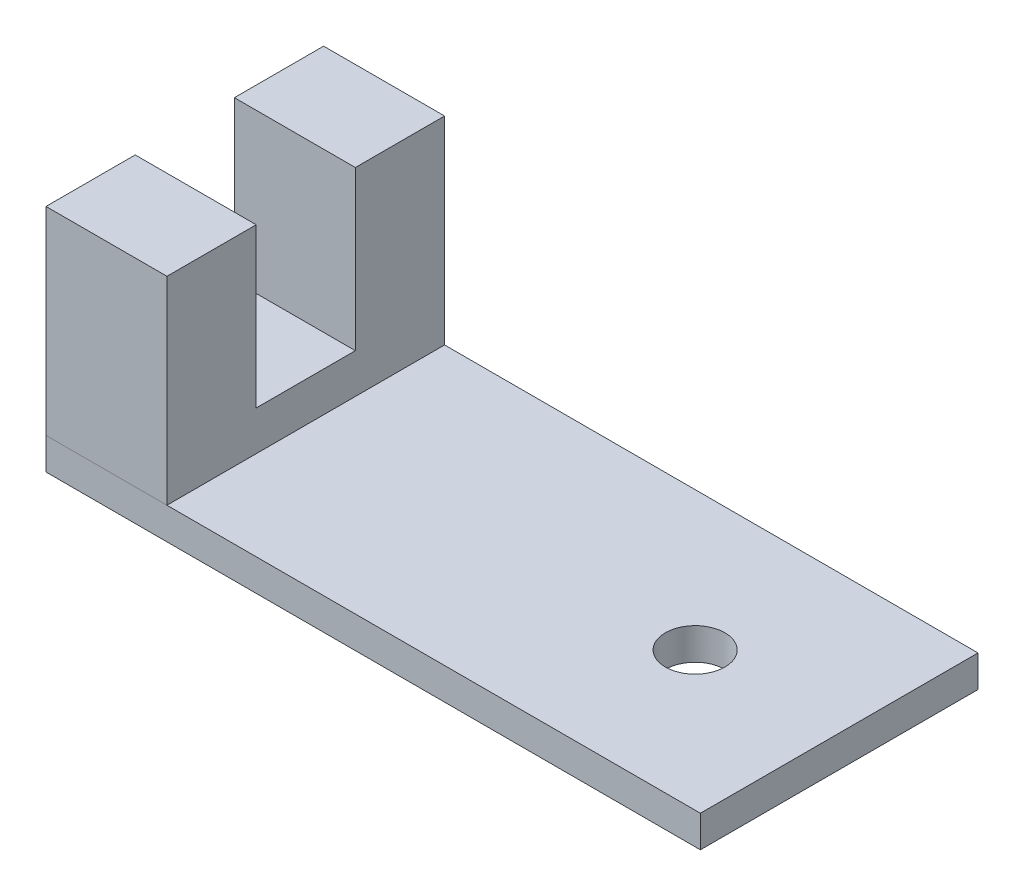
ISO-10303-21;
HEADER;
FILE_DESCRIPTION(('STEP AP214'),'2;1');
FILE_NAME('part.step','',(''),(''),'','','');
FILE_SCHEMA(('AUTOMOTIVE_DESIGN { 1 0 10303 214 1 1 1 1 }'));
ENDSEC;
DATA;
#1=APPLICATION_CONTEXT('core data for automotive mechanical design processes');
#2=APPLICATION_PROTOCOL_DEFINITION('international standard','automotive_design',2000,#1);
#3=PRODUCT_CONTEXT('',#1,'mechanical');
#4=PRODUCT('Part','Part','',(#3));
#5=PRODUCT_RELATED_PRODUCT_CATEGORY('part','',(#4));
#6=PRODUCT_DEFINITION_FORMATION('','',#4);
#7=PRODUCT_DEFINITION_CONTEXT('part definition',#1,'design');
#8=PRODUCT_DEFINITION('design','',#6,#7);
#9=PRODUCT_DEFINITION_SHAPE('','',#8);
#10=(LENGTH_UNIT() NAMED_UNIT(*) SI_UNIT(.MILLI.,.METRE.));
#11=(NAMED_UNIT(*) PLANE_ANGLE_UNIT() SI_UNIT($,.RADIAN.));
#12=(NAMED_UNIT(*) SI_UNIT($,.STERADIAN.) SOLID_ANGLE_UNIT());
#13=UNCERTAINTY_MEASURE_WITH_UNIT(LENGTH_MEASURE(1.E-05),#10,'distance_accuracy_value','');
#14=(GEOMETRIC_REPRESENTATION_CONTEXT(3) GLOBAL_UNCERTAINTY_ASSIGNED_CONTEXT((#13)) GLOBAL_UNIT_ASSIGNED_CONTEXT((#10,
#11,#12)) REPRESENTATION_CONTEXT('',''));
#15=CARTESIAN_POINT('',(0.,0.,0.));
#16=DIRECTION('',(0.,0.,1.));
#17=DIRECTION('',(1.,0.,0.));
#18=AXIS2_PLACEMENT_3D('',#15,#16,#17);
#19=CARTESIAN_POINT('',(-10.4,1.6,7.));
#20=DIRECTION('',(0.,-1.,0.));
#21=DIRECTION('',(0.,0.,-1.));
#22=AXIS2_PLACEMENT_3D('',#19,#20,#21);
#23=PLANE('',#22);
#24=DIRECTION('',(0.,0.,1.));
#25=VECTOR('',#24,1.);
#26=CARTESIAN_POINT('',(-16.5,1.6,7.));
#27=LINE('',#26,#25);
#28=CARTESIAN_POINT('',(-16.5,1.6,-7.));
#29=VERTEX_POINT('',#28);
#30=CARTESIAN_POINT('',(-16.5,1.6,7.));
#31=VERTEX_POINT('',#30);
#32=EDGE_CURVE('E143',#29,#31,#27,.T.);
#33=ORIENTED_EDGE('',*,*,#32,.F.);
#34=DIRECTION('',(-1.,0.,0.));
#35=VECTOR('',#34,1.);
#36=CARTESIAN_POINT('',(-10.4,1.6,-7.));
#37=LINE('',#36,#35);
#38=CARTESIAN_POINT('',(-10.4,1.6,-7.));
#39=VERTEX_POINT('',#38);
#40=EDGE_CURVE('E12',#39,#29,#37,.T.);
#41=ORIENTED_EDGE('',*,*,#40,.F.);
#42=DIRECTION('',(0.,0.,1.));
#43=VECTOR('',#42,1.);
#44=CARTESIAN_POINT('',(-10.4,1.6,7.));
#45=LINE('',#44,#43);
#46=CARTESIAN_POINT('',(-10.4,1.6,7.));
#47=VERTEX_POINT('',#46);
#48=EDGE_CURVE('E163',#39,#47,#45,.T.);
#49=ORIENTED_EDGE('',*,*,#48,.T.);
#50=DIRECTION('',(-1.,0.,0.));
#51=VECTOR('',#50,1.);
#52=CARTESIAN_POINT('',(-10.4,1.6,7.));
#53=LINE('',#52,#51);
#54=EDGE_CURVE('E49',#47,#31,#53,.T.);
#55=ORIENTED_EDGE('',*,*,#54,.T.);
#56=EDGE_LOOP('',(#33,#41,#49,#55));
#57=FACE_BOUND('',#56,.T.);
#58=ADVANCED_FACE('F46',(#57),#23,.T.);
#59=CARTESIAN_POINT('',(-10.4,1.6,-7.));
#60=DIRECTION('',(0.,0.,-1.));
#61=DIRECTION('',(-1.,0.,0.));
#62=AXIS2_PLACEMENT_3D('',#59,#60,#61);
#63=PLANE('',#62);
#64=DIRECTION('',(0.,-1.,0.));
#65=VECTOR('',#64,1.);
#66=CARTESIAN_POINT('',(-16.5,1.6,-7.));
#67=LINE('',#66,#65);
#68=CARTESIAN_POINT('',(-16.5,11.6,-7.));
#69=VERTEX_POINT('',#68);
#70=EDGE_CURVE('E161',#69,#29,#67,.T.);
#71=ORIENTED_EDGE('',*,*,#70,.F.);
#72=DIRECTION('',(-1.,0.,0.));
#73=VECTOR('',#72,1.);
#74=CARTESIAN_POINT('',(-10.4,11.6,-7.));
#75=LINE('',#74,#73);
#76=CARTESIAN_POINT('',(-10.4,11.6,-7.));
#77=VERTEX_POINT('',#76);
#78=EDGE_CURVE('E55',#77,#69,#75,.T.);
#79=ORIENTED_EDGE('',*,*,#78,.F.);
#80=DIRECTION('',(0.,-1.,0.));
#81=VECTOR('',#80,1.);
#82=CARTESIAN_POINT('',(-10.4,1.6,-7.));
#83=LINE('',#82,#81);
#84=EDGE_CURVE('E133',#77,#39,#83,.T.);
#85=ORIENTED_EDGE('',*,*,#84,.T.);
#86=ORIENTED_EDGE('',*,*,#40,.T.);
#87=EDGE_LOOP('',(#71,#79,#85,#86));
#88=FACE_BOUND('',#87,.T.);
#89=ADVANCED_FACE('F175',(#88),#63,.T.);
#90=CARTESIAN_POINT('',(-10.4,11.6,-7.));
#91=DIRECTION('',(0.,1.,0.));
#92=DIRECTION('',(0.,0.,1.));
#93=AXIS2_PLACEMENT_3D('',#90,#91,#92);
#94=PLANE('',#93);
#95=DIRECTION('',(0.,0.,-1.));
#96=VECTOR('',#95,1.);
#97=CARTESIAN_POINT('',(-16.5,11.6,-7.));
#98=LINE('',#97,#96);
#99=CARTESIAN_POINT('',(-16.5,11.6,-2.5));
#100=VERTEX_POINT('',#99);
#101=EDGE_CURVE('E120',#100,#69,#98,.T.);
#102=ORIENTED_EDGE('',*,*,#101,.F.);
#103=DIRECTION('',(-1.,0.,0.));
#104=VECTOR('',#103,1.);
#105=CARTESIAN_POINT('',(-10.4,11.6,-2.5));
#106=LINE('',#105,#104);
#107=CARTESIAN_POINT('',(-10.4,11.6,-2.5));
#108=VERTEX_POINT('',#107);
#109=EDGE_CURVE('E115',#108,#100,#106,.T.);
#110=ORIENTED_EDGE('',*,*,#109,.F.);
#111=DIRECTION('',(0.,0.,-1.));
#112=VECTOR('',#111,1.);
#113=CARTESIAN_POINT('',(-10.4,11.6,-7.));
#114=LINE('',#113,#112);
#115=EDGE_CURVE('E118',#108,#77,#114,.T.);
#116=ORIENTED_EDGE('',*,*,#115,.T.);
#117=ORIENTED_EDGE('',*,*,#78,.T.);
#118=EDGE_LOOP('',(#102,#110,#116,#117));
#119=FACE_BOUND('',#118,.T.);
#120=ADVANCED_FACE('F117',(#119),#94,.T.);
#121=CARTESIAN_POINT('',(-10.4,11.6,-2.5));
#122=DIRECTION('',(0.,0.,1.));
#123=DIRECTION('',(0.,-1.,0.));
#124=AXIS2_PLACEMENT_3D('',#121,#122,#123);
#125=PLANE('',#124);
#126=DIRECTION('',(0.,1.,0.));
#127=VECTOR('',#126,1.);
#128=CARTESIAN_POINT('',(-16.5,11.6,-2.5));
#129=LINE('',#128,#127);
#130=CARTESIAN_POINT('',(-16.5,3.6,-2.5));
#131=VERTEX_POINT('',#130);
#132=EDGE_CURVE('E158',#131,#100,#129,.T.);
#133=ORIENTED_EDGE('',*,*,#132,.F.);
#134=DIRECTION('',(-1.,0.,0.));
#135=VECTOR('',#134,1.);
#136=CARTESIAN_POINT('',(-10.4,3.6,-2.5));
#137=LINE('',#136,#135);
#138=CARTESIAN_POINT('',(-10.4,3.6,-2.5));
#139=VERTEX_POINT('',#138);
#140=EDGE_CURVE('E125',#139,#131,#137,.T.);
#141=ORIENTED_EDGE('',*,*,#140,.F.);
#142=DIRECTION('',(0.,1.,0.));
#143=VECTOR('',#142,1.);
#144=CARTESIAN_POINT('',(-10.4,11.6,-2.5));
#145=LINE('',#144,#143);
#146=EDGE_CURVE('E131',#139,#108,#145,.T.);
#147=ORIENTED_EDGE('',*,*,#146,.T.);
#148=ORIENTED_EDGE('',*,*,#109,.T.);
#149=EDGE_LOOP('',(#133,#141,#147,#148));
#150=FACE_BOUND('',#149,.T.);
#151=ADVANCED_FACE('F135',(#150),#125,.T.);
#152=CARTESIAN_POINT('',(-10.4,3.6,-2.5));
#153=DIRECTION('',(0.,1.,0.));
#154=DIRECTION('',(0.,0.,1.));
#155=AXIS2_PLACEMENT_3D('',#152,#153,#154);
#156=PLANE('',#155);
#157=DIRECTION('',(0.,0.,-1.));
#158=VECTOR('',#157,1.);
#159=CARTESIAN_POINT('',(-16.5,3.6,-2.5));
#160=LINE('',#159,#158);
#161=CARTESIAN_POINT('',(-16.5,3.6,2.5));
#162=VERTEX_POINT('',#161);
#163=EDGE_CURVE('E155',#162,#131,#160,.T.);
#164=ORIENTED_EDGE('',*,*,#163,.F.);
#165=DIRECTION('',(-1.,0.,0.));
#166=VECTOR('',#165,1.);
#167=CARTESIAN_POINT('',(-10.4,3.6,2.5));
#168=LINE('',#167,#166);
#169=CARTESIAN_POINT('',(-10.4,3.6,2.5));
#170=VERTEX_POINT('',#169);
#171=EDGE_CURVE('E167',#170,#162,#168,.T.);
#172=ORIENTED_EDGE('',*,*,#171,.F.);
#173=DIRECTION('',(0.,0.,-1.));
#174=VECTOR('',#173,1.);
#175=CARTESIAN_POINT('',(-10.4,3.6,-2.5));
#176=LINE('',#175,#174);
#177=EDGE_CURVE('E136',#170,#139,#176,.T.);
#178=ORIENTED_EDGE('',*,*,#177,.T.);
#179=ORIENTED_EDGE('',*,*,#140,.T.);
#180=EDGE_LOOP('',(#164,#172,#178,#179));
#181=FACE_BOUND('',#180,.T.);
#182=ADVANCED_FACE('F188',(#181),#156,.T.);
#183=CARTESIAN_POINT('',(-10.4,3.6,2.5));
#184=DIRECTION('',(0.,0.,-1.));
#185=DIRECTION('',(-1.,0.,0.));
#186=AXIS2_PLACEMENT_3D('',#183,#184,#185);
#187=PLANE('',#186);
#188=DIRECTION('',(0.,-1.,0.));
#189=VECTOR('',#188,1.);
#190=CARTESIAN_POINT('',(-16.5,3.6,2.5));
#191=LINE('',#190,#189);
#192=CARTESIAN_POINT('',(-16.5,11.6,2.5));
#193=VERTEX_POINT('',#192);
#194=EDGE_CURVE('E152',#193,#162,#191,.T.);
#195=ORIENTED_EDGE('',*,*,#194,.F.);
#196=DIRECTION('',(-1.,0.,0.));
#197=VECTOR('',#196,1.);
#198=CARTESIAN_POINT('',(-10.4,11.6,2.5));
#199=LINE('',#198,#197);
#200=CARTESIAN_POINT('',(-10.4,11.6,2.5));
#201=VERTEX_POINT('',#200);
#202=EDGE_CURVE('E169',#201,#193,#199,.T.);
#203=ORIENTED_EDGE('',*,*,#202,.F.);
#204=DIRECTION('',(0.,-1.,0.));
#205=VECTOR('',#204,1.);
#206=CARTESIAN_POINT('',(-10.4,3.6,2.5));
#207=LINE('',#206,#205);
#208=EDGE_CURVE('E138',#201,#170,#207,.T.);
#209=ORIENTED_EDGE('',*,*,#208,.T.);
#210=ORIENTED_EDGE('',*,*,#171,.T.);
#211=EDGE_LOOP('',(#195,#203,#209,#210));
#212=FACE_BOUND('',#211,.T.);
#213=ADVANCED_FACE('F191',(#212),#187,.T.);
#214=CARTESIAN_POINT('',(-10.4,11.6,2.5));
#215=DIRECTION('',(0.,1.,0.));
#216=DIRECTION('',(0.,0.,1.));
#217=AXIS2_PLACEMENT_3D('',#214,#215,#216);
#218=PLANE('',#217);
#219=DIRECTION('',(0.,0.,-1.));
#220=VECTOR('',#219,1.);
#221=CARTESIAN_POINT('',(-16.5,11.6,2.5));
#222=LINE('',#221,#220);
#223=CARTESIAN_POINT('',(-16.5,11.6,7.));
#224=VERTEX_POINT('',#223);
#225=EDGE_CURVE('E149',#224,#193,#222,.T.);
#226=ORIENTED_EDGE('',*,*,#225,.F.);
#227=DIRECTION('',(-1.,0.,0.));
#228=VECTOR('',#227,1.);
#229=CARTESIAN_POINT('',(-10.4,11.6,7.));
#230=LINE('',#229,#228);
#231=CARTESIAN_POINT('',(-10.4,11.6,7.));
#232=VERTEX_POINT('',#231);
#233=EDGE_CURVE('E170',#232,#224,#230,.T.);
#234=ORIENTED_EDGE('',*,*,#233,.F.);
#235=DIRECTION('',(0.,0.,-1.));
#236=VECTOR('',#235,1.);
#237=CARTESIAN_POINT('',(-10.4,11.6,2.5));
#238=LINE('',#237,#236);
#239=EDGE_CURVE('E266',#232,#201,#238,.T.);
#240=ORIENTED_EDGE('',*,*,#239,.T.);
#241=ORIENTED_EDGE('',*,*,#202,.T.);
#242=EDGE_LOOP('',(#226,#234,#240,#241));
#243=FACE_BOUND('',#242,.T.);
#244=ADVANCED_FACE('F195',(#243),#218,.T.);
#245=CARTESIAN_POINT('',(-10.4,11.6,7.));
#246=DIRECTION('',(0.,0.,1.));
#247=DIRECTION('',(1.,0.,0.));
#248=AXIS2_PLACEMENT_3D('',#245,#246,#247);
#249=PLANE('',#248);
#250=DIRECTION('',(0.,1.,0.));
#251=VECTOR('',#250,1.);
#252=CARTESIAN_POINT('',(-16.5,11.6,7.));
#253=LINE('',#252,#251);
#254=EDGE_CURVE('E146',#31,#224,#253,.T.);
#255=ORIENTED_EDGE('',*,*,#254,.F.);
#256=ORIENTED_EDGE('',*,*,#54,.F.);
#257=DIRECTION('',(0.,1.,0.));
#258=VECTOR('',#257,1.);
#259=CARTESIAN_POINT('',(-10.4,11.6,7.));
#260=LINE('',#259,#258);
#261=EDGE_CURVE('E267',#47,#232,#260,.T.);
#262=ORIENTED_EDGE('',*,*,#261,.T.);
#263=ORIENTED_EDGE('',*,*,#233,.T.);
#264=EDGE_LOOP('',(#255,#256,#262,#263));
#265=FACE_BOUND('',#264,.T.);
#266=ADVANCED_FACE('F172',(#265),#249,.T.);
#267=CARTESIAN_POINT('',(-10.4,0.,0.));
#268=DIRECTION('',(1.,0.,0.));
#269=DIRECTION('',(0.,0.,-1.));
#270=AXIS2_PLACEMENT_3D('',#267,#268,#269);
#271=PLANE('',#270);
#272=ORIENTED_EDGE('',*,*,#48,.F.);
#273=ORIENTED_EDGE('',*,*,#84,.F.);
#274=ORIENTED_EDGE('',*,*,#115,.F.);
#275=ORIENTED_EDGE('',*,*,#146,.F.);
#276=ORIENTED_EDGE('',*,*,#177,.F.);
#277=ORIENTED_EDGE('',*,*,#208,.F.);
#278=ORIENTED_EDGE('',*,*,#239,.F.);
#279=ORIENTED_EDGE('',*,*,#261,.F.);
#280=EDGE_LOOP('',(#272,#273,#274,#275,#276,#277,#278,#279));
#281=FACE_BOUND('',#280,.T.);
#282=ADVANCED_FACE('F129',(#281),#271,.T.);
#283=CARTESIAN_POINT('',(-16.5,0.,0.));
#284=DIRECTION('',(1.,0.,0.));
#285=DIRECTION('',(0.,0.,-1.));
#286=AXIS2_PLACEMENT_3D('',#283,#284,#285);
#287=PLANE('',#286);
#288=ORIENTED_EDGE('',*,*,#32,.T.);
#289=ORIENTED_EDGE('',*,*,#254,.T.);
#290=ORIENTED_EDGE('',*,*,#225,.T.);
#291=ORIENTED_EDGE('',*,*,#194,.T.);
#292=ORIENTED_EDGE('',*,*,#163,.T.);
#293=ORIENTED_EDGE('',*,*,#132,.T.);
#294=ORIENTED_EDGE('',*,*,#101,.T.);
#295=ORIENTED_EDGE('',*,*,#70,.T.);
#296=EDGE_LOOP('',(#288,#289,#290,#291,#292,#293,#294,#295));
#297=FACE_BOUND('',#296,.T.);
#298=ADVANCED_FACE('F174',(#297),#287,.F.);
#299=CLOSED_SHELL('',(#58,#89,#120,#151,#182,#213,#244,#266,#282,#298));
#300=MANIFOLD_SOLID_BREP('B2',#299);
#301=CARTESIAN_POINT('',(16.5,1.6,7.));
#302=DIRECTION('',(-1.,0.,0.));
#303=DIRECTION('',(0.,0.,1.));
#304=AXIS2_PLACEMENT_3D('',#301,#302,#303);
#305=PLANE('',#304);
#306=DIRECTION('',(0.,0.,-1.));
#307=VECTOR('',#306,1.);
#308=CARTESIAN_POINT('',(16.5,0.,7.));
#309=LINE('',#308,#307);
#310=CARTESIAN_POINT('',(16.5,0.,7.));
#311=VERTEX_POINT('',#310);
#312=CARTESIAN_POINT('',(16.5,0.,-7.));
#313=VERTEX_POINT('',#312);
#314=EDGE_CURVE('E339',#311,#313,#309,.T.);
#315=ORIENTED_EDGE('',*,*,#314,.T.);
#316=DIRECTION('',(0.,-1.,0.));
#317=VECTOR('',#316,1.);
#318=CARTESIAN_POINT('',(16.5,1.6,-7.));
#319=LINE('',#318,#317);
#320=CARTESIAN_POINT('',(16.5,1.6,-7.));
#321=VERTEX_POINT('',#320);
#322=EDGE_CURVE('E44',#321,#313,#319,.T.);
#323=ORIENTED_EDGE('',*,*,#322,.F.);
#324=DIRECTION('',(0.,0.,-1.));
#325=VECTOR('',#324,1.);
#326=CARTESIAN_POINT('',(16.5,1.6,7.));
#327=LINE('',#326,#325);
#328=CARTESIAN_POINT('',(16.5,1.6,7.));
#329=VERTEX_POINT('',#328);
#330=EDGE_CURVE('E326',#329,#321,#327,.T.);
#331=ORIENTED_EDGE('',*,*,#330,.F.);
#332=DIRECTION('',(0.,-1.,0.));
#333=VECTOR('',#332,1.);
#334=CARTESIAN_POINT('',(16.5,1.6,7.));
#335=LINE('',#334,#333);
#336=EDGE_CURVE('E335',#329,#311,#335,.T.);
#337=ORIENTED_EDGE('',*,*,#336,.T.);
#338=EDGE_LOOP('',(#315,#323,#331,#337));
#339=FACE_BOUND('',#338,.T.);
#340=ADVANCED_FACE('F274',(#339),#305,.F.);
#341=CARTESIAN_POINT('',(-16.5,1.6,-7.));
#342=DIRECTION('',(0.,0.,1.));
#343=DIRECTION('',(1.,0.,0.));
#344=AXIS2_PLACEMENT_3D('',#341,#342,#343);
#345=PLANE('',#344);
#346=DIRECTION('',(-1.,0.,0.));
#347=VECTOR('',#346,1.);
#348=CARTESIAN_POINT('',(-16.5,0.,-7.));
#349=LINE('',#348,#347);
#350=CARTESIAN_POINT('',(-16.5,0.,-7.));
#351=VERTEX_POINT('',#350);
#352=EDGE_CURVE('E330',#313,#351,#349,.T.);
#353=ORIENTED_EDGE('',*,*,#352,.T.);
#354=DIRECTION('',(0.,-1.,0.));
#355=VECTOR('',#354,1.);
#356=CARTESIAN_POINT('',(-16.5,1.6,-7.));
#357=LINE('',#356,#355);
#358=CARTESIAN_POINT('',(-16.5,1.6,-7.));
#359=VERTEX_POINT('',#358);
#360=EDGE_CURVE('E283',#359,#351,#357,.T.);
#361=ORIENTED_EDGE('',*,*,#360,.F.);
#362=DIRECTION('',(-1.,0.,0.));
#363=VECTOR('',#362,1.);
#364=CARTESIAN_POINT('',(-16.5,1.6,-7.));
#365=LINE('',#364,#363);
#366=EDGE_CURVE('E321',#321,#359,#365,.T.);
#367=ORIENTED_EDGE('',*,*,#366,.F.);
#368=ORIENTED_EDGE('',*,*,#322,.T.);
#369=EDGE_LOOP('',(#353,#361,#367,#368));
#370=FACE_BOUND('',#369,.T.);
#371=ADVANCED_FACE('F329',(#370),#345,.F.);
#372=CARTESIAN_POINT('',(-16.5,1.6,7.));
#373=DIRECTION('',(1.,0.,0.));
#374=DIRECTION('',(0.,0.,-1.));
#375=AXIS2_PLACEMENT_3D('',#372,#373,#374);
#376=PLANE('',#375);
#377=DIRECTION('',(0.,0.,1.));
#378=VECTOR('',#377,1.);
#379=CARTESIAN_POINT('',(-16.5,0.,7.));
#380=LINE('',#379,#378);
#381=CARTESIAN_POINT('',(-16.5,0.,7.));
#382=VERTEX_POINT('',#381);
#383=EDGE_CURVE('E308',#351,#382,#380,.T.);
#384=ORIENTED_EDGE('',*,*,#383,.T.);
#385=DIRECTION('',(0.,-1.,0.));
#386=VECTOR('',#385,1.);
#387=CARTESIAN_POINT('',(-16.5,1.6,7.));
#388=LINE('',#387,#386);
#389=CARTESIAN_POINT('',(-16.5,1.6,7.));
#390=VERTEX_POINT('',#389);
#391=EDGE_CURVE('E331',#390,#382,#388,.T.);
#392=ORIENTED_EDGE('',*,*,#391,.F.);
#393=DIRECTION('',(0.,0.,1.));
#394=VECTOR('',#393,1.);
#395=CARTESIAN_POINT('',(-16.5,1.6,7.));
#396=LINE('',#395,#394);
#397=EDGE_CURVE('E324',#359,#390,#396,.T.);
#398=ORIENTED_EDGE('',*,*,#397,.F.);
#399=ORIENTED_EDGE('',*,*,#360,.T.);
#400=EDGE_LOOP('',(#384,#392,#398,#399));
#401=FACE_BOUND('',#400,.T.);
#402=ADVANCED_FACE('F333',(#401),#376,.F.);
#403=CARTESIAN_POINT('',(-16.5,1.6,7.));
#404=DIRECTION('',(0.,0.,-1.));
#405=DIRECTION('',(-1.,0.,0.));
#406=AXIS2_PLACEMENT_3D('',#403,#404,#405);
#407=PLANE('',#406);
#408=DIRECTION('',(1.,0.,0.));
#409=VECTOR('',#408,1.);
#410=CARTESIAN_POINT('',(-16.5,0.,7.));
#411=LINE('',#410,#409);
#412=EDGE_CURVE('E314',#382,#311,#411,.T.);
#413=ORIENTED_EDGE('',*,*,#412,.T.);
#414=ORIENTED_EDGE('',*,*,#336,.F.);
#415=DIRECTION('',(1.,0.,0.));
#416=VECTOR('',#415,1.);
#417=CARTESIAN_POINT('',(-16.5,1.6,7.));
#418=LINE('',#417,#416);
#419=EDGE_CURVE('E291',#390,#329,#418,.T.);
#420=ORIENTED_EDGE('',*,*,#419,.F.);
#421=ORIENTED_EDGE('',*,*,#391,.T.);
#422=EDGE_LOOP('',(#413,#414,#420,#421));
#423=FACE_BOUND('',#422,.T.);
#424=ADVANCED_FACE('F346',(#423),#407,.F.);
#425=CARTESIAN_POINT('',(0.,1.6,0.));
#426=DIRECTION('',(0.,-1.,0.));
#427=DIRECTION('',(0.,0.,-1.));
#428=AXIS2_PLACEMENT_3D('',#425,#426,#427);
#429=PLANE('',#428);
#430=CARTESIAN_POINT('',(9.235,1.6,0.));
#431=DIRECTION('',(0.,1.,0.));
#432=DIRECTION('',(0.,0.,1.));
#433=AXIS2_PLACEMENT_3D('',#430,#431,#432);
#434=CIRCLE('',#433,1.5);
#435=CARTESIAN_POINT('',(9.235,1.6,1.5));
#436=VERTEX_POINT('',#435);
#437=EDGE_CURVE('E352',#436,#436,#434,.T.);
#438=ORIENTED_EDGE('',*,*,#437,.F.);
#439=EDGE_LOOP('',(#438));
#440=FACE_BOUND('',#439,.T.);
#441=ORIENTED_EDGE('',*,*,#330,.T.);
#442=ORIENTED_EDGE('',*,*,#366,.T.);
#443=ORIENTED_EDGE('',*,*,#397,.T.);
#444=ORIENTED_EDGE('',*,*,#419,.T.);
#445=EDGE_LOOP('',(#441,#442,#443,#444));
#446=FACE_BOUND('',#445,.T.);
#447=ADVANCED_FACE('F322',(#440,#446),#429,.F.);
#448=CARTESIAN_POINT('',(0.,0.,0.));
#449=DIRECTION('',(0.,-1.,0.));
#450=DIRECTION('',(0.,0.,-1.));
#451=AXIS2_PLACEMENT_3D('',#448,#449,#450);
#452=PLANE('',#451);
#453=CARTESIAN_POINT('',(9.235,0.,0.));
#454=DIRECTION('',(0.,-1.,0.));
#455=DIRECTION('',(0.,0.,-1.));
#456=AXIS2_PLACEMENT_3D('',#453,#454,#455);
#457=CIRCLE('',#456,1.5);
#458=CARTESIAN_POINT('',(9.235,0.,-1.5));
#459=VERTEX_POINT('',#458);
#460=EDGE_CURVE('E277',#459,#459,#457,.T.);
#461=ORIENTED_EDGE('',*,*,#460,.F.);
#462=EDGE_LOOP('',(#461));
#463=FACE_BOUND('',#462,.T.);
#464=ORIENTED_EDGE('',*,*,#314,.F.);
#465=ORIENTED_EDGE('',*,*,#412,.F.);
#466=ORIENTED_EDGE('',*,*,#383,.F.);
#467=ORIENTED_EDGE('',*,*,#352,.F.);
#468=EDGE_LOOP('',(#464,#465,#466,#467));
#469=FACE_BOUND('',#468,.T.);
#470=ADVANCED_FACE('F349',(#463,#469),#452,.T.);
#471=CARTESIAN_POINT('',(9.235,-4.5,0.));
#472=DIRECTION('',(0.,1.,0.));
#473=DIRECTION('',(0.,0.,1.));
#474=AXIS2_PLACEMENT_3D('',#471,#472,#473);
#475=CYLINDRICAL_SURFACE('',#474,1.5);
#476=ORIENTED_EDGE('',*,*,#460,.T.);
#477=EDGE_LOOP('',(#476));
#478=FACE_BOUND('',#477,.T.);
#479=ORIENTED_EDGE('',*,*,#437,.T.);
#480=EDGE_LOOP('',(#479));
#481=FACE_BOUND('',#480,.T.);
#482=ADVANCED_FACE('F359',(#478,#481),#475,.F.);
#483=CLOSED_SHELL('',(#340,#371,#402,#424,#447,#470,#482));
#484=MANIFOLD_SOLID_BREP('B6',#483);
#485=ADVANCED_BREP_SHAPE_REPRESENTATION('',(#18,#300,#484),#14);
#486=SHAPE_DEFINITION_REPRESENTATION(#9,#485);
ENDSEC;
END-ISO-10303-21;
